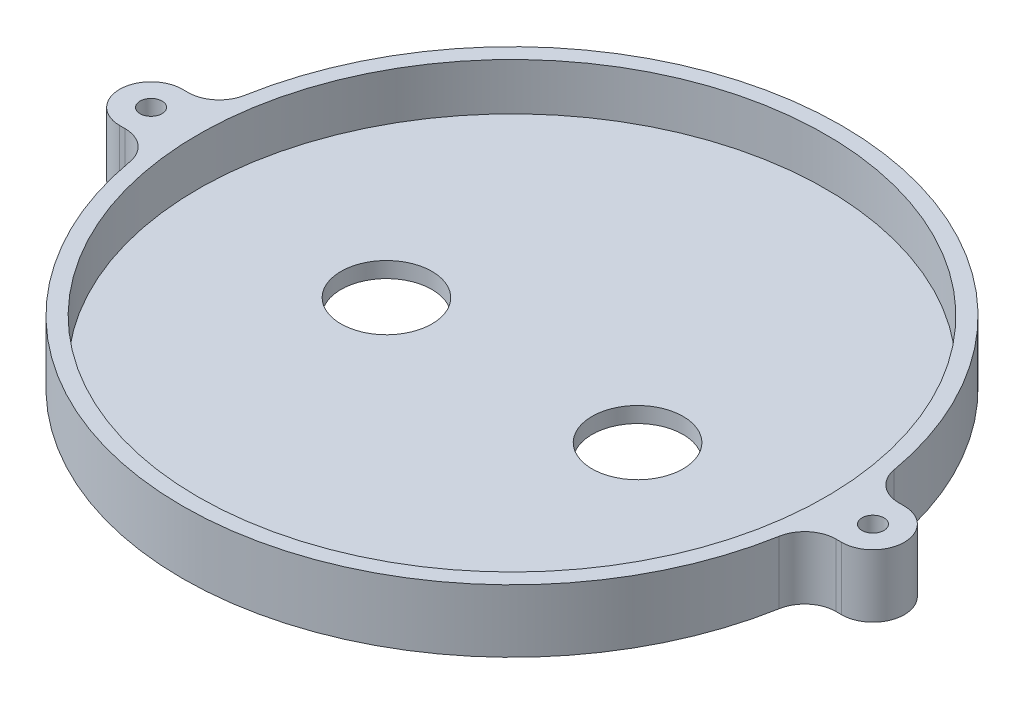
ISO-10303-21;
HEADER;
FILE_DESCRIPTION(('STEP AP214'),'2;1');
FILE_NAME('part.step','',(''),(''),'','','');
FILE_SCHEMA(('AUTOMOTIVE_DESIGN { 1 0 10303 214 1 1 1 1 }'));
ENDSEC;
DATA;
#1=APPLICATION_CONTEXT('core data for automotive mechanical design processes');
#2=APPLICATION_PROTOCOL_DEFINITION('international standard','automotive_design',2000,#1);
#3=PRODUCT_CONTEXT('',#1,'mechanical');
#4=PRODUCT('Part','Part','',(#3));
#5=PRODUCT_RELATED_PRODUCT_CATEGORY('part','',(#4));
#6=PRODUCT_DEFINITION_FORMATION('','',#4);
#7=PRODUCT_DEFINITION_CONTEXT('part definition',#1,'design');
#8=PRODUCT_DEFINITION('design','',#6,#7);
#9=PRODUCT_DEFINITION_SHAPE('','',#8);
#10=(LENGTH_UNIT() NAMED_UNIT(*) SI_UNIT(.MILLI.,.METRE.));
#11=(NAMED_UNIT(*) PLANE_ANGLE_UNIT() SI_UNIT($,.RADIAN.));
#12=(NAMED_UNIT(*) SI_UNIT($,.STERADIAN.) SOLID_ANGLE_UNIT());
#13=UNCERTAINTY_MEASURE_WITH_UNIT(LENGTH_MEASURE(1.E-05),#10,'distance_accuracy_value','');
#14=(GEOMETRIC_REPRESENTATION_CONTEXT(3) GLOBAL_UNCERTAINTY_ASSIGNED_CONTEXT((#13)) GLOBAL_UNIT_ASSIGNED_CONTEXT((#10,
#11,#12)) REPRESENTATION_CONTEXT('',''));
#15=CARTESIAN_POINT('',(0.,0.,0.));
#16=DIRECTION('',(0.,0.,1.));
#17=DIRECTION('',(1.,0.,0.));
#18=AXIS2_PLACEMENT_3D('',#15,#16,#17);
#19=CARTESIAN_POINT('',(0.,7.5,0.));
#20=DIRECTION('',(0.,-1.,0.));
#21=DIRECTION('',(0.,0.,-1.));
#22=AXIS2_PLACEMENT_3D('',#19,#20,#21);
#23=CYLINDRICAL_SURFACE('',#22,52.5);
#24=CARTESIAN_POINT('',(0.,7.5,0.));
#25=DIRECTION('',(0.,1.,0.));
#26=DIRECTION('',(0.,0.,1.));
#27=AXIS2_PLACEMENT_3D('',#24,#25,#26);
#28=CIRCLE('',#27,52.5);
#29=CARTESIAN_POINT('',(51.6999531980497,7.5,-9.13043478260869));
#30=VERTEX_POINT('',#29);
#31=CARTESIAN_POINT('',(-51.6999531980497,7.5,-9.13043478260869));
#32=VERTEX_POINT('',#31);
#33=EDGE_CURVE('E259',#30,#32,#28,.T.);
#34=ORIENTED_EDGE('',*,*,#33,.F.);
#35=DIRECTION('',(0.,-1.,0.));
#36=VECTOR('',#35,1.);
#37=CARTESIAN_POINT('',(51.6999531980497,7.5,-9.13043478260869));
#38=LINE('',#37,#36);
#39=CARTESIAN_POINT('',(51.6999531980497,-2.5,-9.13043478260869));
#40=VERTEX_POINT('',#39);
#41=EDGE_CURVE('E273',#30,#40,#38,.T.);
#42=ORIENTED_EDGE('',*,*,#41,.T.);
#43=CARTESIAN_POINT('',(0.,-2.5,0.));
#44=DIRECTION('',(0.,-1.,0.));
#45=DIRECTION('',(0.,0.,-1.));
#46=AXIS2_PLACEMENT_3D('',#43,#44,#45);
#47=CIRCLE('',#46,52.5);
#48=CARTESIAN_POINT('',(-51.6999531980497,-2.5,-9.13043478260869));
#49=VERTEX_POINT('',#48);
#50=EDGE_CURVE('E252',#49,#40,#47,.T.);
#51=ORIENTED_EDGE('',*,*,#50,.F.);
#52=DIRECTION('',(0.,-1.,0.));
#53=VECTOR('',#52,1.);
#54=CARTESIAN_POINT('',(-51.6999531980497,7.5,-9.13043478260869));
#55=LINE('',#54,#53);
#56=EDGE_CURVE('E271',#49,#32,#55,.F.);
#57=ORIENTED_EDGE('',*,*,#56,.T.);
#58=EDGE_LOOP('',(#34,#42,#51,#57));
#59=FACE_BOUND('',#58,.T.);
#60=ADVANCED_FACE('F84',(#59),#23,.T.);
#61=CARTESIAN_POINT('',(51.6999531980497,-2.5,9.13043478260869));
#62=VERTEX_POINT('',#61);
#63=CARTESIAN_POINT('',(-51.6999531980497,-2.5,9.13043478260869));
#64=VERTEX_POINT('',#63);
#65=EDGE_CURVE('E251',#62,#64,#47,.T.);
#66=ORIENTED_EDGE('',*,*,#65,.F.);
#67=DIRECTION('',(0.,-1.,0.));
#68=VECTOR('',#67,1.);
#69=CARTESIAN_POINT('',(51.6999531980497,7.5,9.13043478260869));
#70=LINE('',#69,#68);
#71=CARTESIAN_POINT('',(51.6999531980497,7.5,9.13043478260869));
#72=VERTEX_POINT('',#71);
#73=EDGE_CURVE('E269',#62,#72,#70,.F.);
#74=ORIENTED_EDGE('',*,*,#73,.T.);
#75=CARTESIAN_POINT('',(-51.6999531980497,7.5,9.13043478260869));
#76=VERTEX_POINT('',#75);
#77=EDGE_CURVE('E263',#76,#72,#28,.T.);
#78=ORIENTED_EDGE('',*,*,#77,.F.);
#79=DIRECTION('',(0.,-1.,0.));
#80=VECTOR('',#79,1.);
#81=CARTESIAN_POINT('',(-51.6999531980497,7.5,9.13043478260869));
#82=LINE('',#81,#80);
#83=EDGE_CURVE('E266',#76,#64,#82,.T.);
#84=ORIENTED_EDGE('',*,*,#83,.T.);
#85=EDGE_LOOP('',(#66,#74,#78,#84));
#86=FACE_BOUND('',#85,.T.);
#87=ADVANCED_FACE('F319',(#86),#23,.T.);
#88=CARTESIAN_POINT('',(0.,7.5,0.));
#89=DIRECTION('',(0.,1.,0.));
#90=DIRECTION('',(0.,0.,1.));
#91=AXIS2_PLACEMENT_3D('',#88,#89,#90);
#92=PLANE('',#91);
#93=DIRECTION('',(1.,0.,0.));
#94=VECTOR('',#93,1.);
#95=CARTESIAN_POINT('',(52.2613624009172,7.5,-4.99999999999999));
#96=LINE('',#95,#94);
#97=CARTESIAN_POINT('',(56.6237582645306,7.5,-5.));
#98=VERTEX_POINT('',#97);
#99=CARTESIAN_POINT('',(57.5,7.5,-5.));
#100=VERTEX_POINT('',#99);
#101=EDGE_CURVE('E193',#98,#100,#96,.T.);
#102=ORIENTED_EDGE('',*,*,#101,.F.);
#103=CARTESIAN_POINT('',(56.6237582645306,7.5,-10.));
#104=DIRECTION('',(0.,1.,0.));
#105=DIRECTION('',(0.,0.,1.));
#106=AXIS2_PLACEMENT_3D('',#103,#104,#105);
#107=CIRCLE('',#106,5.);
#108=EDGE_CURVE('E287',#98,#30,#107,.F.);
#109=ORIENTED_EDGE('',*,*,#108,.T.);
#110=ORIENTED_EDGE('',*,*,#33,.T.);
#111=CARTESIAN_POINT('',(-56.6237582645306,7.5,-10.));
#112=DIRECTION('',(0.,1.,0.));
#113=DIRECTION('',(0.,0.,1.));
#114=AXIS2_PLACEMENT_3D('',#111,#112,#113);
#115=CIRCLE('',#114,5.);
#116=CARTESIAN_POINT('',(-56.6237582645306,7.5,-5.));
#117=VERTEX_POINT('',#116);
#118=EDGE_CURVE('E12',#32,#117,#115,.F.);
#119=ORIENTED_EDGE('',*,*,#118,.T.);
#120=DIRECTION('',(-1.,0.,0.));
#121=VECTOR('',#120,1.);
#122=CARTESIAN_POINT('',(-52.2613624009172,7.5,-4.99999999999999));
#123=LINE('',#122,#121);
#124=CARTESIAN_POINT('',(-57.5,7.5,-5.));
#125=VERTEX_POINT('',#124);
#126=EDGE_CURVE('E222',#117,#125,#123,.T.);
#127=ORIENTED_EDGE('',*,*,#126,.T.);
#128=CARTESIAN_POINT('',(-57.5,7.5,0.));
#129=DIRECTION('',(0.,-1.,0.));
#130=DIRECTION('',(0.,0.,-1.));
#131=AXIS2_PLACEMENT_3D('',#128,#129,#130);
#132=CIRCLE('',#131,5.);
#133=CARTESIAN_POINT('',(-57.5,7.5,5.));
#134=VERTEX_POINT('',#133);
#135=EDGE_CURVE('E225',#134,#125,#132,.T.);
#136=ORIENTED_EDGE('',*,*,#135,.F.);
#137=DIRECTION('',(1.,0.,0.));
#138=VECTOR('',#137,1.);
#139=CARTESIAN_POINT('',(-57.5,7.5,5.));
#140=LINE('',#139,#138);
#141=CARTESIAN_POINT('',(-56.6237582645306,7.5,5.));
#142=VERTEX_POINT('',#141);
#143=EDGE_CURVE('E219',#134,#142,#140,.T.);
#144=ORIENTED_EDGE('',*,*,#143,.T.);
#145=CARTESIAN_POINT('',(-56.6237582645306,7.5,10.));
#146=DIRECTION('',(0.,1.,0.));
#147=DIRECTION('',(0.,0.,1.));
#148=AXIS2_PLACEMENT_3D('',#145,#146,#147);
#149=CIRCLE('',#148,5.);
#150=EDGE_CURVE('E291',#142,#76,#149,.F.);
#151=ORIENTED_EDGE('',*,*,#150,.T.);
#152=ORIENTED_EDGE('',*,*,#77,.T.);
#153=CARTESIAN_POINT('',(56.6237582645306,7.5,10.));
#154=DIRECTION('',(0.,1.,0.));
#155=DIRECTION('',(0.,0.,1.));
#156=AXIS2_PLACEMENT_3D('',#153,#154,#155);
#157=CIRCLE('',#156,5.);
#158=CARTESIAN_POINT('',(56.6237582645306,7.5,5.));
#159=VERTEX_POINT('',#158);
#160=EDGE_CURVE('E199',#72,#159,#157,.F.);
#161=ORIENTED_EDGE('',*,*,#160,.T.);
#162=DIRECTION('',(-1.,0.,0.));
#163=VECTOR('',#162,1.);
#164=CARTESIAN_POINT('',(57.5,7.5,5.));
#165=LINE('',#164,#163);
#166=CARTESIAN_POINT('',(57.5,7.5,5.));
#167=VERTEX_POINT('',#166);
#168=EDGE_CURVE('E177',#167,#159,#165,.T.);
#169=ORIENTED_EDGE('',*,*,#168,.F.);
#170=CARTESIAN_POINT('',(57.5,7.5,0.));
#171=DIRECTION('',(0.,1.,0.));
#172=DIRECTION('',(0.,0.,-1.));
#173=AXIS2_PLACEMENT_3D('',#170,#171,#172);
#174=CIRCLE('',#173,5.);
#175=EDGE_CURVE('E189',#167,#100,#174,.T.);
#176=ORIENTED_EDGE('',*,*,#175,.T.);
#177=EDGE_LOOP('',(#102,#109,#110,#119,#127,#136,#144,#151,#152,#161,#169,#176));
#178=FACE_BOUND('',#177,.T.);
#179=CARTESIAN_POINT('',(57.5,7.5,0.));
#180=DIRECTION('',(0.,1.,0.));
#181=DIRECTION('',(0.,0.,-1.));
#182=AXIS2_PLACEMENT_3D('',#179,#180,#181);
#183=CIRCLE('',#182,1.75);
#184=CARTESIAN_POINT('',(57.5,7.5,-1.75));
#185=VERTEX_POINT('',#184);
#186=EDGE_CURVE('E210',#185,#185,#183,.T.);
#187=ORIENTED_EDGE('',*,*,#186,.F.);
#188=EDGE_LOOP('',(#187));
#189=FACE_BOUND('',#188,.T.);
#190=CARTESIAN_POINT('',(0.,7.5,0.));
#191=DIRECTION('',(0.,1.,0.));
#192=DIRECTION('',(0.,0.,1.));
#193=AXIS2_PLACEMENT_3D('',#190,#191,#192);
#194=CIRCLE('',#193,50.);
#195=CARTESIAN_POINT('',(0.,7.5,50.));
#196=VERTEX_POINT('',#195);
#197=EDGE_CURVE('E256',#196,#196,#194,.T.);
#198=ORIENTED_EDGE('',*,*,#197,.F.);
#199=EDGE_LOOP('',(#198));
#200=FACE_BOUND('',#199,.T.);
#201=CARTESIAN_POINT('',(-57.5,7.5,0.));
#202=DIRECTION('',(0.,-1.,0.));
#203=DIRECTION('',(0.,0.,-1.));
#204=AXIS2_PLACEMENT_3D('',#201,#202,#203);
#205=CIRCLE('',#204,1.75);
#206=CARTESIAN_POINT('',(-57.5,7.5,-1.75));
#207=VERTEX_POINT('',#206);
#208=EDGE_CURVE('E213',#207,#207,#205,.T.);
#209=ORIENTED_EDGE('',*,*,#208,.T.);
#210=EDGE_LOOP('',(#209));
#211=FACE_BOUND('',#210,.T.);
#212=ADVANCED_FACE('F195',(#178,#189,#200,#211),#92,.T.);
#213=CARTESIAN_POINT('',(0.,7.5,0.));
#214=DIRECTION('',(0.,-1.,0.));
#215=DIRECTION('',(0.,0.,-1.));
#216=AXIS2_PLACEMENT_3D('',#213,#214,#215);
#217=CYLINDRICAL_SURFACE('',#216,50.);
#218=ORIENTED_EDGE('',*,*,#197,.T.);
#219=EDGE_LOOP('',(#218));
#220=FACE_BOUND('',#219,.T.);
#221=CARTESIAN_POINT('',(0.,0.,0.));
#222=DIRECTION('',(0.,1.,0.));
#223=DIRECTION('',(0.,0.,1.));
#224=AXIS2_PLACEMENT_3D('',#221,#222,#223);
#225=CIRCLE('',#224,50.);
#226=CARTESIAN_POINT('',(0.,0.,50.));
#227=VERTEX_POINT('',#226);
#228=EDGE_CURVE('E255',#227,#227,#225,.T.);
#229=ORIENTED_EDGE('',*,*,#228,.F.);
#230=EDGE_LOOP('',(#229));
#231=FACE_BOUND('',#230,.T.);
#232=ADVANCED_FACE('F347',(#220,#231),#217,.F.);
#233=CARTESIAN_POINT('',(0.,0.,0.));
#234=DIRECTION('',(0.,-1.,0.));
#235=DIRECTION('',(0.,0.,-1.));
#236=AXIS2_PLACEMENT_3D('',#233,#234,#235);
#237=PLANE('',#236);
#238=CARTESIAN_POINT('',(20.,0.,0.));
#239=DIRECTION('',(0.,-1.,0.));
#240=DIRECTION('',(0.,0.,-1.));
#241=AXIS2_PLACEMENT_3D('',#238,#239,#240);
#242=CIRCLE('',#241,7.25);
#243=CARTESIAN_POINT('',(20.,0.,-7.25000000000001));
#244=VERTEX_POINT('',#243);
#245=EDGE_CURVE('E248',#244,#244,#242,.T.);
#246=ORIENTED_EDGE('',*,*,#245,.T.);
#247=EDGE_LOOP('',(#246));
#248=FACE_BOUND('',#247,.T.);
#249=CARTESIAN_POINT('',(-20.,0.,0.));
#250=DIRECTION('',(0.,-1.,0.));
#251=DIRECTION('',(0.,0.,-1.));
#252=AXIS2_PLACEMENT_3D('',#249,#250,#251);
#253=CIRCLE('',#252,7.25);
#254=CARTESIAN_POINT('',(-20.,0.,-7.25000000000001));
#255=VERTEX_POINT('',#254);
#256=EDGE_CURVE('E243',#255,#255,#253,.T.);
#257=ORIENTED_EDGE('',*,*,#256,.T.);
#258=EDGE_LOOP('',(#257));
#259=FACE_BOUND('',#258,.T.);
#260=ORIENTED_EDGE('',*,*,#228,.T.);
#261=EDGE_LOOP('',(#260));
#262=FACE_BOUND('',#261,.T.);
#263=ADVANCED_FACE('F350',(#248,#259,#262),#237,.F.);
#264=CARTESIAN_POINT('',(0.,-2.5,0.));
#265=DIRECTION('',(0.,-1.,0.));
#266=DIRECTION('',(0.,0.,-1.));
#267=AXIS2_PLACEMENT_3D('',#264,#265,#266);
#268=PLANE('',#267);
#269=DIRECTION('',(-1.,0.,0.));
#270=VECTOR('',#269,1.);
#271=CARTESIAN_POINT('',(-52.2613624009172,-2.5,-4.99999999999999));
#272=LINE('',#271,#270);
#273=CARTESIAN_POINT('',(-56.6237582645306,-2.5,-5.));
#274=VERTEX_POINT('',#273);
#275=CARTESIAN_POINT('',(-57.5,-2.5,-5.));
#276=VERTEX_POINT('',#275);
#277=EDGE_CURVE('E231',#274,#276,#272,.T.);
#278=ORIENTED_EDGE('',*,*,#277,.F.);
#279=CARTESIAN_POINT('',(-56.6237582645306,-2.5,-10.));
#280=DIRECTION('',(0.,-1.,0.));
#281=DIRECTION('',(0.,0.,-1.));
#282=AXIS2_PLACEMENT_3D('',#279,#280,#281);
#283=CIRCLE('',#282,5.);
#284=EDGE_CURVE('E92',#274,#49,#283,.F.);
#285=ORIENTED_EDGE('',*,*,#284,.T.);
#286=ORIENTED_EDGE('',*,*,#50,.T.);
#287=CARTESIAN_POINT('',(56.6237582645306,-2.5,-10.));
#288=DIRECTION('',(0.,-1.,0.));
#289=DIRECTION('',(0.,0.,-1.));
#290=AXIS2_PLACEMENT_3D('',#287,#288,#289);
#291=CIRCLE('',#290,5.);
#292=CARTESIAN_POINT('',(56.6237582645306,-2.5,-5.));
#293=VERTEX_POINT('',#292);
#294=EDGE_CURVE('E285',#40,#293,#291,.F.);
#295=ORIENTED_EDGE('',*,*,#294,.T.);
#296=DIRECTION('',(1.,0.,0.));
#297=VECTOR('',#296,1.);
#298=CARTESIAN_POINT('',(52.2613624009172,-2.5,-4.99999999999999));
#299=LINE('',#298,#297);
#300=CARTESIAN_POINT('',(57.5,-2.5,-5.));
#301=VERTEX_POINT('',#300);
#302=EDGE_CURVE('E200',#293,#301,#299,.T.);
#303=ORIENTED_EDGE('',*,*,#302,.T.);
#304=CARTESIAN_POINT('',(57.5,-2.5,0.));
#305=DIRECTION('',(0.,1.,0.));
#306=DIRECTION('',(0.,0.,-1.));
#307=AXIS2_PLACEMENT_3D('',#304,#305,#306);
#308=CIRCLE('',#307,5.);
#309=CARTESIAN_POINT('',(57.5,-2.5,5.));
#310=VERTEX_POINT('',#309);
#311=EDGE_CURVE('E202',#310,#301,#308,.T.);
#312=ORIENTED_EDGE('',*,*,#311,.F.);
#313=DIRECTION('',(-1.,0.,0.));
#314=VECTOR('',#313,1.);
#315=CARTESIAN_POINT('',(57.5,-2.5,5.));
#316=LINE('',#315,#314);
#317=CARTESIAN_POINT('',(56.6237582645306,-2.5,5.));
#318=VERTEX_POINT('',#317);
#319=EDGE_CURVE('E180',#310,#318,#316,.T.);
#320=ORIENTED_EDGE('',*,*,#319,.T.);
#321=CARTESIAN_POINT('',(56.6237582645306,-2.5,10.));
#322=DIRECTION('',(0.,-1.,0.));
#323=DIRECTION('',(0.,0.,-1.));
#324=AXIS2_PLACEMENT_3D('',#321,#322,#323);
#325=CIRCLE('',#324,5.);
#326=EDGE_CURVE('E282',#318,#62,#325,.F.);
#327=ORIENTED_EDGE('',*,*,#326,.T.);
#328=ORIENTED_EDGE('',*,*,#65,.T.);
#329=CARTESIAN_POINT('',(-56.6237582645306,-2.5,10.));
#330=DIRECTION('',(0.,-1.,0.));
#331=DIRECTION('',(0.,0.,-1.));
#332=AXIS2_PLACEMENT_3D('',#329,#330,#331);
#333=CIRCLE('',#332,5.);
#334=CARTESIAN_POINT('',(-56.6237582645306,-2.5,5.));
#335=VERTEX_POINT('',#334);
#336=EDGE_CURVE('E289',#64,#335,#333,.F.);
#337=ORIENTED_EDGE('',*,*,#336,.T.);
#338=DIRECTION('',(1.,0.,0.));
#339=VECTOR('',#338,1.);
#340=CARTESIAN_POINT('',(-57.5,-2.5,5.));
#341=LINE('',#340,#339);
#342=CARTESIAN_POINT('',(-57.5,-2.5,5.));
#343=VERTEX_POINT('',#342);
#344=EDGE_CURVE('E216',#343,#335,#341,.T.);
#345=ORIENTED_EDGE('',*,*,#344,.F.);
#346=CARTESIAN_POINT('',(-57.5,-2.5,0.));
#347=DIRECTION('',(0.,-1.,0.));
#348=DIRECTION('',(0.,0.,-1.));
#349=AXIS2_PLACEMENT_3D('',#346,#347,#348);
#350=CIRCLE('',#349,5.);
#351=EDGE_CURVE('E223',#343,#276,#350,.T.);
#352=ORIENTED_EDGE('',*,*,#351,.T.);
#353=EDGE_LOOP('',(#278,#285,#286,#295,#303,#312,#320,#327,#328,#337,#345,#352));
#354=FACE_BOUND('',#353,.T.);
#355=CARTESIAN_POINT('',(20.,-2.5,0.));
#356=DIRECTION('',(0.,-1.,0.));
#357=DIRECTION('',(0.,0.,-1.));
#358=AXIS2_PLACEMENT_3D('',#355,#356,#357);
#359=CIRCLE('',#358,7.25);
#360=CARTESIAN_POINT('',(20.,-2.5,-7.25000000000001));
#361=VERTEX_POINT('',#360);
#362=EDGE_CURVE('E240',#361,#361,#359,.T.);
#363=ORIENTED_EDGE('',*,*,#362,.F.);
#364=EDGE_LOOP('',(#363));
#365=FACE_BOUND('',#364,.T.);
#366=CARTESIAN_POINT('',(-20.,-2.5,0.));
#367=DIRECTION('',(0.,-1.,0.));
#368=DIRECTION('',(0.,0.,-1.));
#369=AXIS2_PLACEMENT_3D('',#366,#367,#368);
#370=CIRCLE('',#369,7.25);
#371=CARTESIAN_POINT('',(-20.,-2.5,-7.25000000000001));
#372=VERTEX_POINT('',#371);
#373=EDGE_CURVE('E239',#372,#372,#370,.T.);
#374=ORIENTED_EDGE('',*,*,#373,.F.);
#375=EDGE_LOOP('',(#374));
#376=FACE_BOUND('',#375,.T.);
#377=CARTESIAN_POINT('',(-57.5,-2.5,0.));
#378=DIRECTION('',(0.,-1.,0.));
#379=DIRECTION('',(0.,0.,-1.));
#380=AXIS2_PLACEMENT_3D('',#377,#378,#379);
#381=CIRCLE('',#380,1.75);
#382=CARTESIAN_POINT('',(-57.5,-2.5,-1.75));
#383=VERTEX_POINT('',#382);
#384=EDGE_CURVE('E184',#383,#383,#381,.T.);
#385=ORIENTED_EDGE('',*,*,#384,.F.);
#386=EDGE_LOOP('',(#385));
#387=FACE_BOUND('',#386,.T.);
#388=CARTESIAN_POINT('',(57.5,-2.5,0.));
#389=DIRECTION('',(0.,1.,0.));
#390=DIRECTION('',(0.,0.,-1.));
#391=AXIS2_PLACEMENT_3D('',#388,#389,#390);
#392=CIRCLE('',#391,1.75);
#393=CARTESIAN_POINT('',(57.5,-2.5,-1.75));
#394=VERTEX_POINT('',#393);
#395=EDGE_CURVE('E205',#394,#394,#392,.T.);
#396=ORIENTED_EDGE('',*,*,#395,.T.);
#397=EDGE_LOOP('',(#396));
#398=FACE_BOUND('',#397,.T.);
#399=ADVANCED_FACE('F295',(#354,#365,#376,#387,#398),#268,.T.);
#400=CARTESIAN_POINT('',(-20.,7.5,0.));
#401=DIRECTION('',(0.,-1.,0.));
#402=DIRECTION('',(0.,0.,-1.));
#403=AXIS2_PLACEMENT_3D('',#400,#401,#402);
#404=CYLINDRICAL_SURFACE('',#403,7.25);
#405=ORIENTED_EDGE('',*,*,#373,.T.);
#406=EDGE_LOOP('',(#405));
#407=FACE_BOUND('',#406,.T.);
#408=ORIENTED_EDGE('',*,*,#256,.F.);
#409=EDGE_LOOP('',(#408));
#410=FACE_BOUND('',#409,.T.);
#411=ADVANCED_FACE('F357',(#407,#410),#404,.F.);
#412=CARTESIAN_POINT('',(20.,7.5,0.));
#413=DIRECTION('',(0.,-1.,0.));
#414=DIRECTION('',(0.,0.,-1.));
#415=AXIS2_PLACEMENT_3D('',#412,#413,#414);
#416=CYLINDRICAL_SURFACE('',#415,7.25);
#417=ORIENTED_EDGE('',*,*,#362,.T.);
#418=EDGE_LOOP('',(#417));
#419=FACE_BOUND('',#418,.T.);
#420=ORIENTED_EDGE('',*,*,#245,.F.);
#421=EDGE_LOOP('',(#420));
#422=FACE_BOUND('',#421,.T.);
#423=ADVANCED_FACE('F360',(#419,#422),#416,.F.);
#424=CARTESIAN_POINT('',(-57.5,7.5,5.));
#425=DIRECTION('',(0.,0.,-1.));
#426=DIRECTION('',(-1.,0.,0.));
#427=AXIS2_PLACEMENT_3D('',#424,#425,#426);
#428=PLANE('',#427);
#429=ORIENTED_EDGE('',*,*,#344,.T.);
#430=DIRECTION('',(0.,1.,0.));
#431=VECTOR('',#430,1.);
#432=CARTESIAN_POINT('',(-56.6237582645306,7.5,5.));
#433=LINE('',#432,#431);
#434=EDGE_CURVE('E278',#335,#142,#433,.T.);
#435=ORIENTED_EDGE('',*,*,#434,.T.);
#436=ORIENTED_EDGE('',*,*,#143,.F.);
#437=DIRECTION('',(0.,-1.,0.));
#438=VECTOR('',#437,1.);
#439=CARTESIAN_POINT('',(-57.5,7.5,5.));
#440=LINE('',#439,#438);
#441=EDGE_CURVE('E228',#134,#343,#440,.T.);
#442=ORIENTED_EDGE('',*,*,#441,.T.);
#443=EDGE_LOOP('',(#429,#435,#436,#442));
#444=FACE_BOUND('',#443,.T.);
#445=ADVANCED_FACE('F311',(#444),#428,.F.);
#446=CARTESIAN_POINT('',(-52.2613624009172,7.5,-4.99999999999999));
#447=DIRECTION('',(0.,0.,1.));
#448=DIRECTION('',(1.,0.,0.));
#449=AXIS2_PLACEMENT_3D('',#446,#447,#448);
#450=PLANE('',#449);
#451=ORIENTED_EDGE('',*,*,#126,.F.);
#452=DIRECTION('',(0.,1.,0.));
#453=VECTOR('',#452,1.);
#454=CARTESIAN_POINT('',(-56.6237582645306,-2.5,-5.));
#455=LINE('',#454,#453);
#456=EDGE_CURVE('E280',#117,#274,#455,.F.);
#457=ORIENTED_EDGE('',*,*,#456,.T.);
#458=ORIENTED_EDGE('',*,*,#277,.T.);
#459=DIRECTION('',(0.,-1.,0.));
#460=VECTOR('',#459,1.);
#461=CARTESIAN_POINT('',(-57.5,7.5,-5.));
#462=LINE('',#461,#460);
#463=EDGE_CURVE('E236',#125,#276,#462,.T.);
#464=ORIENTED_EDGE('',*,*,#463,.F.);
#465=EDGE_LOOP('',(#451,#457,#458,#464));
#466=FACE_BOUND('',#465,.T.);
#467=ADVANCED_FACE('F301',(#466),#450,.F.);
#468=CARTESIAN_POINT('',(-57.5,7.5,0.));
#469=DIRECTION('',(0.,-1.,0.));
#470=DIRECTION('',(0.,0.,-1.));
#471=AXIS2_PLACEMENT_3D('',#468,#469,#470);
#472=CYLINDRICAL_SURFACE('',#471,5.);
#473=ORIENTED_EDGE('',*,*,#351,.F.);
#474=ORIENTED_EDGE('',*,*,#441,.F.);
#475=ORIENTED_EDGE('',*,*,#135,.T.);
#476=ORIENTED_EDGE('',*,*,#463,.T.);
#477=EDGE_LOOP('',(#473,#474,#475,#476));
#478=FACE_BOUND('',#477,.T.);
#479=ADVANCED_FACE('F308',(#478),#472,.T.);
#480=CARTESIAN_POINT('',(-57.5,7.5,0.));
#481=DIRECTION('',(0.,-1.,0.));
#482=DIRECTION('',(0.,0.,-1.));
#483=AXIS2_PLACEMENT_3D('',#480,#481,#482);
#484=CYLINDRICAL_SURFACE('',#483,1.75);
#485=ORIENTED_EDGE('',*,*,#208,.F.);
#486=EDGE_LOOP('',(#485));
#487=FACE_BOUND('',#486,.T.);
#488=ORIENTED_EDGE('',*,*,#384,.T.);
#489=EDGE_LOOP('',(#488));
#490=FACE_BOUND('',#489,.T.);
#491=ADVANCED_FACE('F371',(#487,#490),#484,.F.);
#492=CARTESIAN_POINT('',(57.5,7.5,5.));
#493=DIRECTION('',(0.,0.,1.));
#494=DIRECTION('',(1.,0.,0.));
#495=AXIS2_PLACEMENT_3D('',#492,#493,#494);
#496=PLANE('',#495);
#497=ORIENTED_EDGE('',*,*,#168,.T.);
#498=DIRECTION('',(0.,-1.,0.));
#499=VECTOR('',#498,1.);
#500=CARTESIAN_POINT('',(56.6237582645306,7.5,5.));
#501=LINE('',#500,#499);
#502=EDGE_CURVE('E264',#159,#318,#501,.T.);
#503=ORIENTED_EDGE('',*,*,#502,.T.);
#504=ORIENTED_EDGE('',*,*,#319,.F.);
#505=DIRECTION('',(0.,-1.,0.));
#506=VECTOR('',#505,1.);
#507=CARTESIAN_POINT('',(57.5,7.5,5.));
#508=LINE('',#507,#506);
#509=EDGE_CURVE('E172',#167,#310,#508,.T.);
#510=ORIENTED_EDGE('',*,*,#509,.F.);
#511=EDGE_LOOP('',(#497,#503,#504,#510));
#512=FACE_BOUND('',#511,.T.);
#513=ADVANCED_FACE('F174',(#512),#496,.T.);
#514=CARTESIAN_POINT('',(57.5,7.5,0.));
#515=DIRECTION('',(0.,-1.,0.));
#516=DIRECTION('',(0.,0.,-1.));
#517=AXIS2_PLACEMENT_3D('',#514,#515,#516);
#518=CYLINDRICAL_SURFACE('',#517,5.);
#519=ORIENTED_EDGE('',*,*,#311,.T.);
#520=DIRECTION('',(0.,-1.,0.));
#521=VECTOR('',#520,1.);
#522=CARTESIAN_POINT('',(57.5,7.5,-5.));
#523=LINE('',#522,#521);
#524=EDGE_CURVE('E185',#100,#301,#523,.T.);
#525=ORIENTED_EDGE('',*,*,#524,.F.);
#526=ORIENTED_EDGE('',*,*,#175,.F.);
#527=ORIENTED_EDGE('',*,*,#509,.T.);
#528=EDGE_LOOP('',(#519,#525,#526,#527));
#529=FACE_BOUND('',#528,.T.);
#530=ADVANCED_FACE('F190',(#529),#518,.T.);
#531=CARTESIAN_POINT('',(52.2613624009172,7.5,-4.99999999999999));
#532=DIRECTION('',(0.,0.,-1.));
#533=DIRECTION('',(-1.,0.,0.));
#534=AXIS2_PLACEMENT_3D('',#531,#532,#533);
#535=PLANE('',#534);
#536=ORIENTED_EDGE('',*,*,#302,.F.);
#537=DIRECTION('',(0.,-1.,0.));
#538=VECTOR('',#537,1.);
#539=CARTESIAN_POINT('',(56.6237582645306,7.5,-5.));
#540=LINE('',#539,#538);
#541=EDGE_CURVE('E276',#293,#98,#540,.F.);
#542=ORIENTED_EDGE('',*,*,#541,.T.);
#543=ORIENTED_EDGE('',*,*,#101,.T.);
#544=ORIENTED_EDGE('',*,*,#524,.T.);
#545=EDGE_LOOP('',(#536,#542,#543,#544));
#546=FACE_BOUND('',#545,.T.);
#547=ADVANCED_FACE('F327',(#546),#535,.T.);
#548=CARTESIAN_POINT('',(57.5,7.5,0.));
#549=DIRECTION('',(0.,-1.,0.));
#550=DIRECTION('',(0.,0.,-1.));
#551=AXIS2_PLACEMENT_3D('',#548,#549,#550);
#552=CYLINDRICAL_SURFACE('',#551,1.75);
#553=ORIENTED_EDGE('',*,*,#186,.T.);
#554=EDGE_LOOP('',(#553));
#555=FACE_BOUND('',#554,.T.);
#556=ORIENTED_EDGE('',*,*,#395,.F.);
#557=EDGE_LOOP('',(#556));
#558=FACE_BOUND('',#557,.T.);
#559=ADVANCED_FACE('F337',(#555,#558),#552,.F.);
#560=CARTESIAN_POINT('',(56.6237582645306,7.5,10.));
#561=DIRECTION('',(0.,-1.,0.));
#562=DIRECTION('',(0.,0.,-1.));
#563=AXIS2_PLACEMENT_3D('',#560,#561,#562);
#564=CYLINDRICAL_SURFACE('',#563,5.);
#565=ORIENTED_EDGE('',*,*,#160,.F.);
#566=ORIENTED_EDGE('',*,*,#73,.F.);
#567=ORIENTED_EDGE('',*,*,#326,.F.);
#568=ORIENTED_EDGE('',*,*,#502,.F.);
#569=EDGE_LOOP('',(#565,#566,#567,#568));
#570=FACE_BOUND('',#569,.T.);
#571=ADVANCED_FACE('F323',(#570),#564,.F.);
#572=CARTESIAN_POINT('',(56.6237582645306,7.5,-10.));
#573=DIRECTION('',(0.,-1.,0.));
#574=DIRECTION('',(0.,0.,-1.));
#575=AXIS2_PLACEMENT_3D('',#572,#573,#574);
#576=CYLINDRICAL_SURFACE('',#575,5.);
#577=ORIENTED_EDGE('',*,*,#108,.F.);
#578=ORIENTED_EDGE('',*,*,#541,.F.);
#579=ORIENTED_EDGE('',*,*,#294,.F.);
#580=ORIENTED_EDGE('',*,*,#41,.F.);
#581=EDGE_LOOP('',(#577,#578,#579,#580));
#582=FACE_BOUND('',#581,.T.);
#583=ADVANCED_FACE('F330',(#582),#576,.F.);
#584=CARTESIAN_POINT('',(-56.6237582645306,7.5,10.));
#585=DIRECTION('',(0.,-1.,0.));
#586=DIRECTION('',(0.,0.,-1.));
#587=AXIS2_PLACEMENT_3D('',#584,#585,#586);
#588=CYLINDRICAL_SURFACE('',#587,5.);
#589=ORIENTED_EDGE('',*,*,#150,.F.);
#590=ORIENTED_EDGE('',*,*,#434,.F.);
#591=ORIENTED_EDGE('',*,*,#336,.F.);
#592=ORIENTED_EDGE('',*,*,#83,.F.);
#593=EDGE_LOOP('',(#589,#590,#591,#592));
#594=FACE_BOUND('',#593,.T.);
#595=ADVANCED_FACE('F314',(#594),#588,.F.);
#596=CARTESIAN_POINT('',(-56.6237582645306,7.5,-10.));
#597=DIRECTION('',(0.,-1.,0.));
#598=DIRECTION('',(0.,0.,-1.));
#599=AXIS2_PLACEMENT_3D('',#596,#597,#598);
#600=CYLINDRICAL_SURFACE('',#599,5.);
#601=ORIENTED_EDGE('',*,*,#118,.F.);
#602=ORIENTED_EDGE('',*,*,#56,.F.);
#603=ORIENTED_EDGE('',*,*,#284,.F.);
#604=ORIENTED_EDGE('',*,*,#456,.F.);
#605=EDGE_LOOP('',(#601,#602,#603,#604));
#606=FACE_BOUND('',#605,.T.);
#607=ADVANCED_FACE('F86',(#606),#600,.F.);
#608=CLOSED_SHELL('',(#60,#87,#212,#232,#263,#399,#411,#423,#445,#467,#479,#491,#513,#530,#547,
#559,#571,#583,#595,#607));
#609=MANIFOLD_SOLID_BREP('B2',#608);
#610=ADVANCED_BREP_SHAPE_REPRESENTATION('',(#18,#609),#14);
#611=SHAPE_DEFINITION_REPRESENTATION(#9,#610);
ENDSEC;
END-ISO-10303-21;
